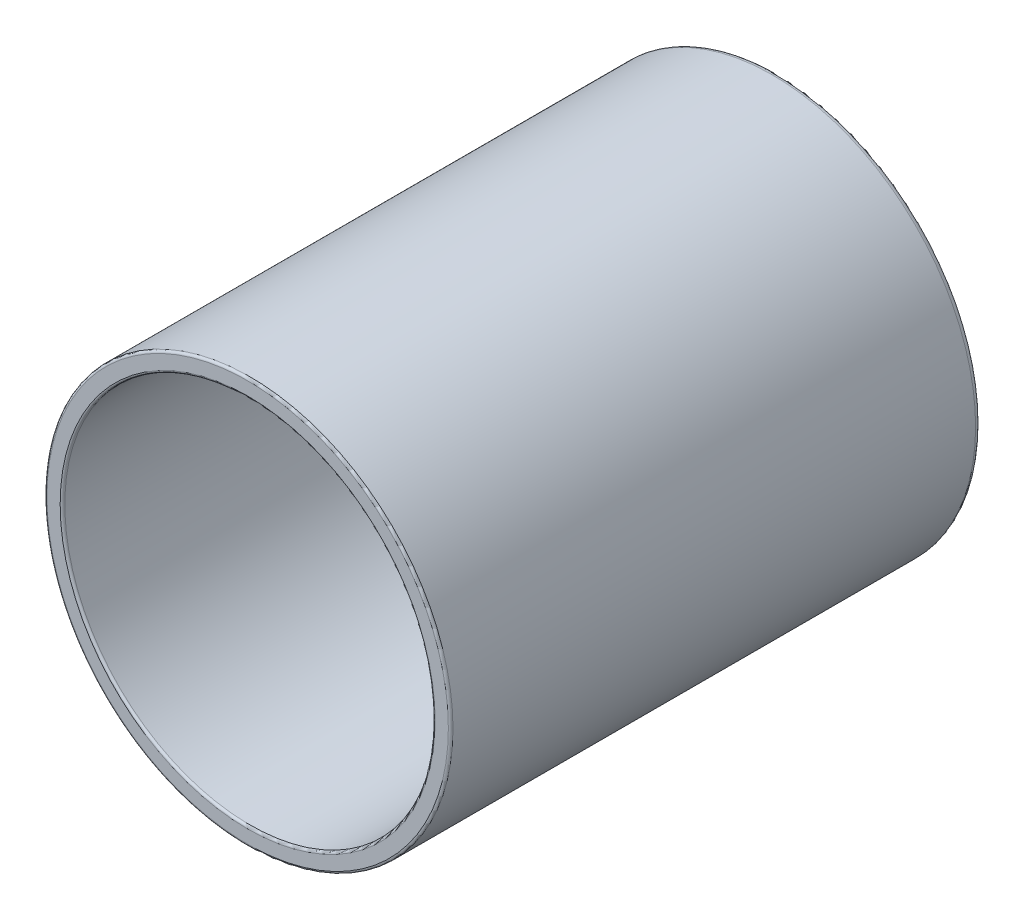
ISO-10303-21;
HEADER;
FILE_DESCRIPTION(('STEP AP214'),'2;1');
FILE_NAME('part.step','',(''),(''),'','','');
FILE_SCHEMA(('AUTOMOTIVE_DESIGN { 1 0 10303 214 1 1 1 1 }'));
ENDSEC;
DATA;
#1=APPLICATION_CONTEXT('core data for automotive mechanical design processes');
#2=APPLICATION_PROTOCOL_DEFINITION('international standard','automotive_design',2000,#1);
#3=PRODUCT_CONTEXT('',#1,'mechanical');
#4=PRODUCT('Part','Part','',(#3));
#5=PRODUCT_RELATED_PRODUCT_CATEGORY('part','',(#4));
#6=PRODUCT_DEFINITION_FORMATION('','',#4);
#7=PRODUCT_DEFINITION_CONTEXT('part definition',#1,'design');
#8=PRODUCT_DEFINITION('design','',#6,#7);
#9=PRODUCT_DEFINITION_SHAPE('','',#8);
#10=(LENGTH_UNIT() NAMED_UNIT(*) SI_UNIT(.MILLI.,.METRE.));
#11=(NAMED_UNIT(*) PLANE_ANGLE_UNIT() SI_UNIT($,.RADIAN.));
#12=(NAMED_UNIT(*) SI_UNIT($,.STERADIAN.) SOLID_ANGLE_UNIT());
#13=UNCERTAINTY_MEASURE_WITH_UNIT(LENGTH_MEASURE(1.E-05),#10,'distance_accuracy_value','');
#14=(GEOMETRIC_REPRESENTATION_CONTEXT(3) GLOBAL_UNCERTAINTY_ASSIGNED_CONTEXT((#13)) GLOBAL_UNIT_ASSIGNED_CONTEXT((#10,
#11,#12)) REPRESENTATION_CONTEXT('',''));
#15=CARTESIAN_POINT('',(0.,0.,0.));
#16=DIRECTION('',(0.,0.,1.));
#17=DIRECTION('',(1.,0.,0.));
#18=AXIS2_PLACEMENT_3D('',#15,#16,#17);
#19=CARTESIAN_POINT('',(-3.3055896643972,2.98021947293267,22.9));
#20=DIRECTION('',(0.,0.,-1.));
#21=DIRECTION('',(-1.,0.,0.));
#22=AXIS2_PLACEMENT_3D('',#19,#20,#21);
#23=CYLINDRICAL_SURFACE('',#22,8.76);
#24=CARTESIAN_POINT('',(-3.3055896643972,2.98021947293267,22.8));
#25=DIRECTION('',(0.,0.,1.));
#26=DIRECTION('',(1.,0.,0.));
#27=AXIS2_PLACEMENT_3D('',#24,#25,#26);
#28=CIRCLE('',#27,8.76);
#29=CARTESIAN_POINT('',(5.4544103356028,2.98021947293267,22.8));
#30=VERTEX_POINT('',#29);
#31=EDGE_CURVE('E38',#30,#30,#28,.F.);
#32=ORIENTED_EDGE('',*,*,#31,.T.);
#33=EDGE_LOOP('',(#32));
#34=FACE_BOUND('',#33,.T.);
#35=CARTESIAN_POINT('',(-3.3055896643972,2.98021947293267,0.25));
#36=DIRECTION('',(0.,0.,1.));
#37=DIRECTION('',(1.,0.,0.));
#38=AXIS2_PLACEMENT_3D('',#35,#36,#37);
#39=CIRCLE('',#38,8.76);
#40=CARTESIAN_POINT('',(5.4544103356028,2.98021947293267,0.25));
#41=VERTEX_POINT('',#40);
#42=EDGE_CURVE('E54',#41,#41,#39,.T.);
#43=ORIENTED_EDGE('',*,*,#42,.T.);
#44=EDGE_LOOP('',(#43));
#45=FACE_BOUND('',#44,.T.);
#46=ADVANCED_FACE('F31',(#34,#45),#23,.T.);
#47=CARTESIAN_POINT('',(-3.3055896643972,2.98021947293267,22.9));
#48=DIRECTION('',(0.,0.,1.));
#49=DIRECTION('',(1.,0.,0.));
#50=AXIS2_PLACEMENT_3D('',#47,#48,#49);
#51=PLANE('',#50);
#52=CARTESIAN_POINT('',(-3.3055896643972,2.98021947293267,22.9));
#53=DIRECTION('',(0.,0.,1.));
#54=DIRECTION('',(1.,0.,0.));
#55=AXIS2_PLACEMENT_3D('',#52,#53,#54);
#56=CIRCLE('',#55,8.66);
#57=CARTESIAN_POINT('',(5.3544103356028,2.98021947293267,22.9));
#58=VERTEX_POINT('',#57);
#59=EDGE_CURVE('E42',#58,#58,#56,.T.);
#60=ORIENTED_EDGE('',*,*,#59,.T.);
#61=EDGE_LOOP('',(#60));
#62=FACE_BOUND('',#61,.T.);
#63=CARTESIAN_POINT('',(-3.3055896643972,2.98021947293267,22.9));
#64=DIRECTION('',(0.,0.,1.));
#65=DIRECTION('',(1.,0.,0.));
#66=AXIS2_PLACEMENT_3D('',#63,#64,#65);
#67=CIRCLE('',#66,8.09);
#68=CARTESIAN_POINT('',(4.7844103356028,2.98021947293267,22.9));
#69=VERTEX_POINT('',#68);
#70=EDGE_CURVE('E46',#69,#69,#67,.F.);
#71=ORIENTED_EDGE('',*,*,#70,.T.);
#72=EDGE_LOOP('',(#71));
#73=FACE_BOUND('',#72,.T.);
#74=ADVANCED_FACE('F83',(#62,#73),#51,.T.);
#75=CARTESIAN_POINT('',(-3.3055896643972,2.98021947293267,0.));
#76=DIRECTION('',(0.,0.,1.));
#77=DIRECTION('',(1.,0.,0.));
#78=AXIS2_PLACEMENT_3D('',#75,#76,#77);
#79=PLANE('',#78);
#80=CARTESIAN_POINT('',(-3.3055896643972,2.98021947293267,0.));
#81=DIRECTION('',(0.,0.,1.));
#82=DIRECTION('',(1.,0.,0.));
#83=AXIS2_PLACEMENT_3D('',#80,#81,#82);
#84=CIRCLE('',#83,8.51);
#85=CARTESIAN_POINT('',(5.2044103356028,2.98021947293267,0.));
#86=VERTEX_POINT('',#85);
#87=EDGE_CURVE('E51',#86,#86,#84,.F.);
#88=ORIENTED_EDGE('',*,*,#87,.T.);
#89=EDGE_LOOP('',(#88));
#90=FACE_BOUND('',#89,.T.);
#91=ADVANCED_FACE('F87',(#90),#79,.F.);
#92=CARTESIAN_POINT('',(-3.3055896643972,2.98021947293267,22.9));
#93=DIRECTION('',(0.,0.,-1.));
#94=DIRECTION('',(-1.,0.,0.));
#95=AXIS2_PLACEMENT_3D('',#92,#93,#94);
#96=CYLINDRICAL_SURFACE('',#95,7.99);
#97=CARTESIAN_POINT('',(-3.3055896643972,2.98021947293267,22.8));
#98=DIRECTION('',(0.,0.,1.));
#99=DIRECTION('',(1.,0.,0.));
#100=AXIS2_PLACEMENT_3D('',#97,#98,#99);
#101=CIRCLE('',#100,7.99);
#102=CARTESIAN_POINT('',(4.6844103356028,2.98021947293267,22.8));
#103=VERTEX_POINT('',#102);
#104=EDGE_CURVE('E10',#103,#103,#101,.T.);
#105=ORIENTED_EDGE('',*,*,#104,.T.);
#106=EDGE_LOOP('',(#105));
#107=FACE_BOUND('',#106,.T.);
#108=CARTESIAN_POINT('',(-3.3055896643972,2.98021947293267,1.02));
#109=DIRECTION('',(0.,0.,1.));
#110=DIRECTION('',(1.,0.,0.));
#111=AXIS2_PLACEMENT_3D('',#108,#109,#110);
#112=CIRCLE('',#111,7.99);
#113=CARTESIAN_POINT('',(4.6844103356028,2.98021947293267,1.02));
#114=VERTEX_POINT('',#113);
#115=EDGE_CURVE('E57',#114,#114,#112,.F.);
#116=ORIENTED_EDGE('',*,*,#115,.T.);
#117=EDGE_LOOP('',(#116));
#118=FACE_BOUND('',#117,.T.);
#119=ADVANCED_FACE('F78',(#107,#118),#96,.F.);
#120=CARTESIAN_POINT('',(-3.3055896643972,2.98021947293267,0.77));
#121=DIRECTION('',(0.,0.,1.));
#122=DIRECTION('',(1.,0.,0.));
#123=AXIS2_PLACEMENT_3D('',#120,#121,#122);
#124=PLANE('',#123);
#125=CARTESIAN_POINT('',(-3.3055896643972,2.98021947293267,0.77));
#126=DIRECTION('',(0.,0.,1.));
#127=DIRECTION('',(1.,0.,0.));
#128=AXIS2_PLACEMENT_3D('',#125,#126,#127);
#129=CIRCLE('',#128,7.74);
#130=CARTESIAN_POINT('',(4.4344103356028,2.98021947293267,0.77));
#131=VERTEX_POINT('',#130);
#132=EDGE_CURVE('E60',#131,#131,#129,.T.);
#133=ORIENTED_EDGE('',*,*,#132,.T.);
#134=EDGE_LOOP('',(#133));
#135=FACE_BOUND('',#134,.T.);
#136=ADVANCED_FACE('F64',(#135),#124,.T.);
#137=CARTESIAN_POINT('',(-3.3055896643972,2.98021947293267,1.02));
#138=DIRECTION('',(0.,0.,1.));
#139=DIRECTION('',(1.,0.,0.));
#140=AXIS2_PLACEMENT_3D('',#137,#138,#139);
#141=TOROIDAL_SURFACE('',#140,7.74,0.25);
#142=ORIENTED_EDGE('',*,*,#115,.F.);
#143=EDGE_LOOP('',(#142));
#144=FACE_BOUND('',#143,.T.);
#145=ORIENTED_EDGE('',*,*,#132,.F.);
#146=EDGE_LOOP('',(#145));
#147=FACE_BOUND('',#146,.T.);
#148=ADVANCED_FACE('F66',(#144,#147),#141,.F.);
#149=CARTESIAN_POINT('',(-3.3055896643972,2.98021947293267,0.25));
#150=DIRECTION('',(0.,0.,1.));
#151=DIRECTION('',(1.,0.,0.));
#152=AXIS2_PLACEMENT_3D('',#149,#150,#151);
#153=TOROIDAL_SURFACE('',#152,8.51,0.25);
#154=ORIENTED_EDGE('',*,*,#87,.F.);
#155=EDGE_LOOP('',(#154));
#156=FACE_BOUND('',#155,.T.);
#157=ORIENTED_EDGE('',*,*,#42,.F.);
#158=EDGE_LOOP('',(#157));
#159=FACE_BOUND('',#158,.T.);
#160=ADVANCED_FACE('F68',(#156,#159),#153,.T.);
#161=CARTESIAN_POINT('',(-3.3055896643972,2.98021947293267,22.8));
#162=DIRECTION('',(0.,0.,1.));
#163=DIRECTION('',(1.,0.,0.));
#164=AXIS2_PLACEMENT_3D('',#161,#162,#163);
#165=TOROIDAL_SURFACE('',#164,8.66,0.1);
#166=ORIENTED_EDGE('',*,*,#31,.F.);
#167=EDGE_LOOP('',(#166));
#168=FACE_BOUND('',#167,.T.);
#169=ORIENTED_EDGE('',*,*,#59,.F.);
#170=EDGE_LOOP('',(#169));
#171=FACE_BOUND('',#170,.T.);
#172=ADVANCED_FACE('F75',(#168,#171),#165,.T.);
#173=CARTESIAN_POINT('',(-3.3055896643972,2.98021947293267,22.8));
#174=DIRECTION('',(0.,0.,1.));
#175=DIRECTION('',(1.,0.,0.));
#176=AXIS2_PLACEMENT_3D('',#173,#174,#175);
#177=TOROIDAL_SURFACE('',#176,8.09,0.1);
#178=ORIENTED_EDGE('',*,*,#70,.F.);
#179=EDGE_LOOP('',(#178));
#180=FACE_BOUND('',#179,.T.);
#181=ORIENTED_EDGE('',*,*,#104,.F.);
#182=EDGE_LOOP('',(#181));
#183=FACE_BOUND('',#182,.T.);
#184=ADVANCED_FACE('F33',(#180,#183),#177,.T.);
#185=CLOSED_SHELL('',(#46,#74,#91,#119,#136,#148,#160,#172,#184));
#186=MANIFOLD_SOLID_BREP('B2',#185);
#187=ADVANCED_BREP_SHAPE_REPRESENTATION('',(#18,#186),#14);
#188=SHAPE_DEFINITION_REPRESENTATION(#9,#187);
ENDSEC;
END-ISO-10303-21;
